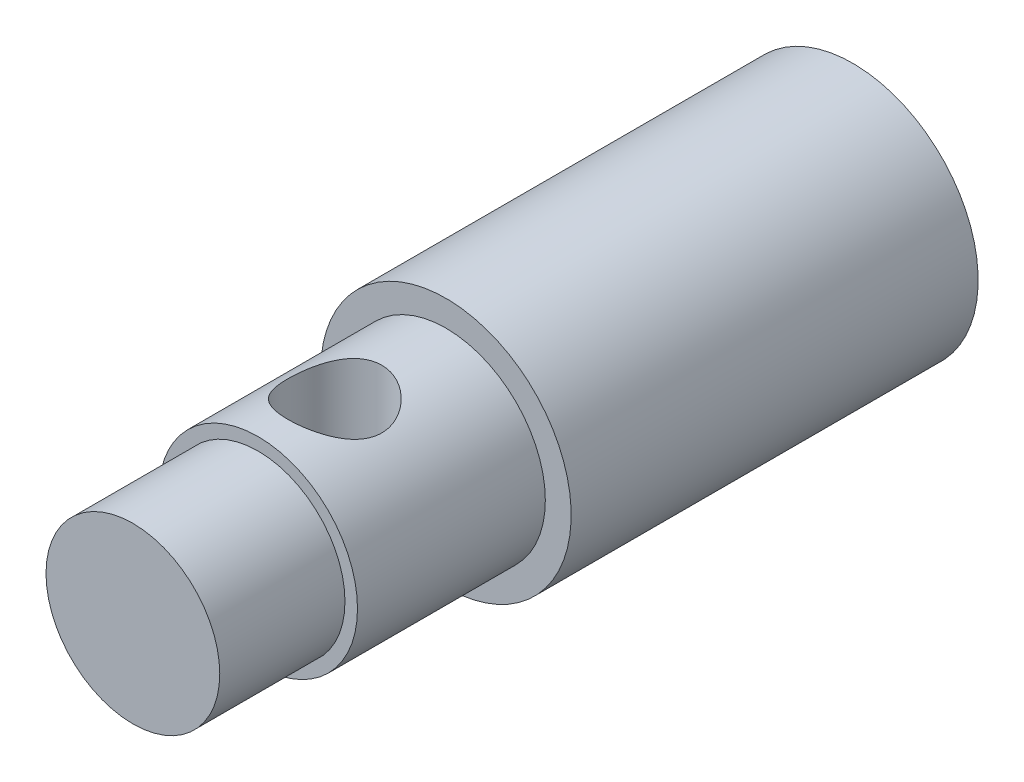
ISO-10303-21;
HEADER;
FILE_DESCRIPTION(('STEP AP214'),'2;1');
FILE_NAME('part.step','',(''),(''),'','','');
FILE_SCHEMA(('AUTOMOTIVE_DESIGN { 1 0 10303 214 1 1 1 1 }'));
ENDSEC;
DATA;
#1=APPLICATION_CONTEXT('core data for automotive mechanical design processes');
#2=APPLICATION_PROTOCOL_DEFINITION('international standard','automotive_design',2000,#1);
#3=PRODUCT_CONTEXT('',#1,'mechanical');
#4=PRODUCT('Part','Part','',(#3));
#5=PRODUCT_RELATED_PRODUCT_CATEGORY('part','',(#4));
#6=PRODUCT_DEFINITION_FORMATION('','',#4);
#7=PRODUCT_DEFINITION_CONTEXT('part definition',#1,'design');
#8=PRODUCT_DEFINITION('design','',#6,#7);
#9=PRODUCT_DEFINITION_SHAPE('','',#8);
#10=(LENGTH_UNIT() NAMED_UNIT(*) SI_UNIT(.MILLI.,.METRE.));
#11=(NAMED_UNIT(*) PLANE_ANGLE_UNIT() SI_UNIT($,.RADIAN.));
#12=(NAMED_UNIT(*) SI_UNIT($,.STERADIAN.) SOLID_ANGLE_UNIT());
#13=UNCERTAINTY_MEASURE_WITH_UNIT(LENGTH_MEASURE(1.E-05),#10,'distance_accuracy_value','');
#14=(GEOMETRIC_REPRESENTATION_CONTEXT(3) GLOBAL_UNCERTAINTY_ASSIGNED_CONTEXT((#13)) GLOBAL_UNIT_ASSIGNED_CONTEXT((#10,
#11,#12)) REPRESENTATION_CONTEXT('',''));
#15=CARTESIAN_POINT('',(0.,0.,0.));
#16=DIRECTION('',(0.,0.,1.));
#17=DIRECTION('',(1.,0.,0.));
#18=AXIS2_PLACEMENT_3D('',#15,#16,#17);
#19=CARTESIAN_POINT('',(0.,0.,13.));
#20=DIRECTION('',(0.,0.,-1.));
#21=DIRECTION('',(-1.,0.,0.));
#22=AXIS2_PLACEMENT_3D('',#19,#20,#21);
#23=CYLINDRICAL_SURFACE('',#22,4.);
#24=CARTESIAN_POINT('',(0.,0.,13.));
#25=DIRECTION('',(0.,0.,1.));
#26=DIRECTION('',(1.,0.,0.));
#27=AXIS2_PLACEMENT_3D('',#24,#25,#26);
#28=CIRCLE('',#27,4.);
#29=CARTESIAN_POINT('',(-4.,0.,13.));
#30=VERTEX_POINT('',#29);
#31=EDGE_CURVE('E60',#30,#30,#28,.T.);
#32=CARTESIAN_POINT('',(0.,0.,0.));
#33=DIRECTION('',(0.,0.,1.));
#34=DIRECTION('',(1.,0.,0.));
#35=AXIS2_PLACEMENT_3D('',#32,#33,#34);
#36=CIRCLE('',#35,4.);
#37=CARTESIAN_POINT('',(-4.,0.,0.));
#38=VERTEX_POINT('',#37);
#39=EDGE_CURVE('E68',#38,#38,#36,.T.);
#40=CARTESIAN_POINT('',(-4.,0.,13.));
#41=CARTESIAN_POINT('',(-4.,0.,12.8645833333333));
#42=CARTESIAN_POINT('',(-4.,0.,12.7291666666667));
#43=CARTESIAN_POINT('',(-4.,0.,12.4583333333333));
#44=CARTESIAN_POINT('',(-4.,0.,12.3229166666667));
#45=CARTESIAN_POINT('',(-4.,0.,12.0520833333333));
#46=CARTESIAN_POINT('',(-4.,0.,11.9166666666667));
#47=CARTESIAN_POINT('',(-4.,0.,11.6458333333333));
#48=CARTESIAN_POINT('',(-4.,0.,11.5104166666667));
#49=CARTESIAN_POINT('',(-4.,0.,11.2395833333333));
#50=CARTESIAN_POINT('',(-4.,0.,11.1041666666667));
#51=CARTESIAN_POINT('',(-4.,0.,10.8333333333333));
#52=CARTESIAN_POINT('',(-4.,0.,10.6979166666667));
#53=CARTESIAN_POINT('',(-4.,0.,10.4270833333333));
#54=CARTESIAN_POINT('',(-4.,0.,10.2916666666667));
#55=CARTESIAN_POINT('',(-4.,0.,10.0208333333333));
#56=CARTESIAN_POINT('',(-4.,0.,9.88541666666667));
#57=CARTESIAN_POINT('',(-4.,0.,9.61458333333333));
#58=CARTESIAN_POINT('',(-4.,0.,9.47916666666667));
#59=CARTESIAN_POINT('',(-4.,0.,9.20833333333333));
#60=CARTESIAN_POINT('',(-4.,0.,9.07291666666667));
#61=CARTESIAN_POINT('',(-4.,0.,8.80208333333333));
#62=CARTESIAN_POINT('',(-4.,0.,8.66666666666667));
#63=CARTESIAN_POINT('',(-4.,0.,8.39583333333333));
#64=CARTESIAN_POINT('',(-4.,0.,8.26041666666667));
#65=CARTESIAN_POINT('',(-4.,0.,7.98958333333333));
#66=CARTESIAN_POINT('',(-4.,0.,7.85416666666667));
#67=CARTESIAN_POINT('',(-4.,0.,7.58333333333333));
#68=CARTESIAN_POINT('',(-4.,0.,7.44791666666667));
#69=CARTESIAN_POINT('',(-4.,0.,7.17708333333333));
#70=CARTESIAN_POINT('',(-4.,0.,7.04166666666667));
#71=CARTESIAN_POINT('',(-4.,0.,6.77083333333333));
#72=CARTESIAN_POINT('',(-4.,0.,6.63541666666667));
#73=CARTESIAN_POINT('',(-4.,0.,6.36458333333333));
#74=CARTESIAN_POINT('',(-4.,0.,6.22916666666667));
#75=CARTESIAN_POINT('',(-4.,0.,5.95833333333333));
#76=CARTESIAN_POINT('',(-4.,0.,5.82291666666667));
#77=CARTESIAN_POINT('',(-4.,0.,5.55208333333333));
#78=CARTESIAN_POINT('',(-4.,0.,5.41666666666667));
#79=CARTESIAN_POINT('',(-4.,0.,5.14583333333333));
#80=CARTESIAN_POINT('',(-4.,0.,5.01041666666667));
#81=CARTESIAN_POINT('',(-4.,0.,4.73958333333333));
#82=CARTESIAN_POINT('',(-4.,0.,4.60416666666667));
#83=CARTESIAN_POINT('',(-4.,0.,4.33333333333333));
#84=CARTESIAN_POINT('',(-4.,0.,4.19791666666667));
#85=CARTESIAN_POINT('',(-4.,0.,3.92708333333333));
#86=CARTESIAN_POINT('',(-4.,0.,3.79166666666667));
#87=CARTESIAN_POINT('',(-4.,0.,3.52083333333333));
#88=CARTESIAN_POINT('',(-4.,0.,3.38541666666667));
#89=CARTESIAN_POINT('',(-4.,0.,3.11458333333333));
#90=CARTESIAN_POINT('',(-4.,0.,2.97916666666667));
#91=CARTESIAN_POINT('',(-4.,0.,2.70833333333333));
#92=CARTESIAN_POINT('',(-4.,0.,2.57291666666667));
#93=CARTESIAN_POINT('',(-4.,0.,2.30208333333333));
#94=CARTESIAN_POINT('',(-4.,0.,2.16666666666667));
#95=CARTESIAN_POINT('',(-4.,0.,1.89583333333333));
#96=CARTESIAN_POINT('',(-4.,0.,1.76041666666667));
#97=CARTESIAN_POINT('',(-4.,0.,1.48958333333333));
#98=CARTESIAN_POINT('',(-4.,0.,1.35416666666667));
#99=CARTESIAN_POINT('',(-4.,0.,1.08333333333333));
#100=CARTESIAN_POINT('',(-4.,0.,0.947916666666667));
#101=CARTESIAN_POINT('',(-4.,0.,0.677083333333334));
#102=CARTESIAN_POINT('',(-4.,0.,0.541666666666667));
#103=CARTESIAN_POINT('',(-4.,0.,0.270833333333334));
#104=CARTESIAN_POINT('',(-4.,0.,0.135416666666667));
#105=CARTESIAN_POINT('',(-4.,0.,0.));
#106=B_SPLINE_CURVE_WITH_KNOTS('',3,(#40,#41,#42,#43,#44,#45,#46,#47,#48,#49,#50,#51,#52,#53,
#54,#55,#56,#57,#58,#59,#60,#61,#62,#63,#64,#65,#66,#67,#68,#69,#70,#71,#72,#73,#74,#75,#76,#77,
#78,#79,#80,#81,#82,#83,#84,#85,#86,#87,#88,#89,#90,#91,#92,#93,#94,#95,#96,#97,#98,#99,#100,
#101,#102,#103,#104,#105),.UNSPECIFIED.,.F.,.F.,(4,2,2,2,2,2,2,2,2,2,2,2,2,2,2,2,2,2,2,2,2,2,2,
2,2,2,2,2,2,2,2,2,4),(0.,0.406249999999999,0.812499999999999,1.21875,1.625,2.03125,2.4375,
2.84375,3.25,3.65625,4.0625,4.46875,4.875,5.28125,5.6875,6.09375,6.5,6.90625,7.3125,7.71875,
8.125,8.53125,8.9375,9.34375,9.75,10.15625,10.5625,10.96875,11.375,11.78125,12.1875,12.59375,
13.),.UNSPECIFIED.);
#107=EDGE_CURVE('BSEAM41',#30,#38,#106,.T.);
#108=ORIENTED_EDGE('',*,*,#31,.F.);
#109=ORIENTED_EDGE('',*,*,#39,.T.);
#110=ORIENTED_EDGE('',*,*,#107,.T.);
#111=ORIENTED_EDGE('',*,*,#107,.F.);
#112=EDGE_LOOP('',(#108,#110,#109,#111));
#113=FACE_BOUND('',#112,.T.);
#114=ADVANCED_FACE('F41',(#113),#23,.T.);
#115=CARTESIAN_POINT('',(0.,0.,13.));
#116=DIRECTION('',(0.,0.,1.));
#117=DIRECTION('',(1.,0.,0.));
#118=AXIS2_PLACEMENT_3D('',#115,#116,#117);
#119=PLANE('',#118);
#120=CARTESIAN_POINT('',(0.,0.,13.));
#121=DIRECTION('',(0.,0.,1.));
#122=DIRECTION('',(1.,0.,0.));
#123=AXIS2_PLACEMENT_3D('',#120,#121,#122);
#124=CIRCLE('',#123,3.175);
#125=CARTESIAN_POINT('',(3.175,0.,13.));
#126=VERTEX_POINT('',#125);
#127=EDGE_CURVE('E54',#126,#126,#124,.T.);
#128=ORIENTED_EDGE('',*,*,#127,.F.);
#129=EDGE_LOOP('',(#128));
#130=FACE_BOUND('',#129,.T.);
#131=ORIENTED_EDGE('',*,*,#31,.T.);
#132=EDGE_LOOP('',(#131));
#133=FACE_BOUND('',#132,.T.);
#134=ADVANCED_FACE('F108',(#130,#133),#119,.T.);
#135=CARTESIAN_POINT('',(0.,0.,0.));
#136=DIRECTION('',(0.,0.,1.));
#137=DIRECTION('',(1.,0.,0.));
#138=AXIS2_PLACEMENT_3D('',#135,#136,#137);
#139=PLANE('',#138);
#140=ORIENTED_EDGE('',*,*,#39,.F.);
#141=EDGE_LOOP('',(#140));
#142=FACE_BOUND('',#141,.T.);
#143=ADVANCED_FACE('F104',(#142),#139,.F.);
#144=CARTESIAN_POINT('',(0.,0.,19.));
#145=DIRECTION('',(0.,0.,-1.));
#146=DIRECTION('',(-1.,0.,0.));
#147=AXIS2_PLACEMENT_3D('',#144,#145,#146);
#148=CYLINDRICAL_SURFACE('',#147,3.175);
#149=CARTESIAN_POINT('',(0.,-3.175,18.05));
#150=CARTESIAN_POINT('',(0.0793696056331877,-3.17499621985294,18.0499955261035));
#151=CARTESIAN_POINT('',(0.158848966213319,-3.17199120370814,18.0436633534842));
#152=CARTESIAN_POINT('',(0.3154907966577,-3.16026762742416,18.0185996128575));
#153=CARTESIAN_POINT('',(0.392647876041672,-3.15153670753249,17.9998412211258));
#154=CARTESIAN_POINT('',(0.54213461401645,-3.1292818514019,17.9508046338603));
#155=CARTESIAN_POINT('',(0.614481134826975,-3.11577583396693,17.920569474688));
#156=CARTESIAN_POINT('',(0.752982757479881,-3.08523557557938,17.8496444683175));
#157=CARTESIAN_POINT('',(0.819138798737006,-3.06820187122341,17.8089562109142));
#158=CARTESIAN_POINT('',(0.947531977551393,-3.03109215002452,17.7156866275469));
#159=CARTESIAN_POINT('',(1.00934531536298,-3.01089949607389,17.6625689176526));
#160=CARTESIAN_POINT('',(1.12356872804672,-2.97016877751052,17.5470940154181));
#161=CARTESIAN_POINT('',(1.17597245123061,-2.94963048974006,17.4847306335115));
#162=CARTESIAN_POINT('',(1.27340721108708,-2.90895734211161,17.3474843645497));
#163=CARTESIAN_POINT('',(1.31770529611402,-2.88894252906622,17.2720415431448));
#164=CARTESIAN_POINT('',(1.39279860497067,-2.85350194913633,17.1137145060508));
#165=CARTESIAN_POINT('',(1.4236026358555,-2.83807319122874,17.0308351865709));
#166=CARTESIAN_POINT('',(1.46896762087975,-2.81484981523147,16.8648173299765));
#167=CARTESIAN_POINT('',(1.48434942407678,-2.80667245171199,16.7819591045865));
#168=CARTESIAN_POINT('',(1.50096994970779,-2.79782290647243,16.6144666996695));
#169=CARTESIAN_POINT('',(1.5022201551264,-2.79714463118969,16.5298340180599));
#170=CARTESIAN_POINT('',(1.49114871052963,-2.80305593263808,16.3706246914023));
#171=CARTESIAN_POINT('',(1.48022366031689,-2.80889771224103,16.2959168405557));
#172=CARTESIAN_POINT('',(1.44750469243097,-2.82589657910714,16.1495553191353));
#173=CARTESIAN_POINT('',(1.42570787921159,-2.83705508237193,16.0779024677406));
#174=CARTESIAN_POINT('',(1.37144042107045,-2.86368711079333,15.9376785427478));
#175=CARTESIAN_POINT('',(1.33873421633754,-2.87925460442575,15.8692173067294));
#176=CARTESIAN_POINT('',(1.26375034917989,-2.91294481240157,15.7384442293082));
#177=CARTESIAN_POINT('',(1.22146847336964,-2.93106865023239,15.6761351122786));
#178=CARTESIAN_POINT('',(1.12301829304094,-2.97027967308475,15.5521139821014));
#179=CARTESIAN_POINT('',(1.06582685913966,-2.99147184174414,15.4912446582645));
#180=CARTESIAN_POINT('',(0.941911654521739,-3.03276969244737,15.3796330789879));
#181=CARTESIAN_POINT('',(0.875184240523148,-3.05287495516681,15.3288947119873));
#182=CARTESIAN_POINT('',(0.730900451942526,-3.09065813188422,15.2372344695054));
#183=CARTESIAN_POINT('',(0.65303276474939,-3.10821737934191,15.1967498749094));
#184=CARTESIAN_POINT('',(0.490549806409964,-3.13795896561378,15.1297651472587));
#185=CARTESIAN_POINT('',(0.405939389394616,-3.15014513198241,15.1032550567205));
#186=CARTESIAN_POINT('',(0.239325331183663,-3.16698849385516,15.0669532783005));
#187=CARTESIAN_POINT('',(0.157618085372369,-3.17215069636453,15.0560369777487));
#188=CARTESIAN_POINT('',(-0.00662006237334126,-3.17605374308904,15.0477654982747));
#189=CARTESIAN_POINT('',(-0.0891506200914323,-3.17479716715133,15.050404871034));
#190=CARTESIAN_POINT('',(-0.246790904756254,-3.16631250425399,15.0684589502259));
#191=CARTESIAN_POINT('',(-0.322025617263288,-3.15949303898597,15.0829996821211));
#192=CARTESIAN_POINT('',(-0.468859911387633,-3.14106249856194,15.1231274662938));
#193=CARTESIAN_POINT('',(-0.540459070755478,-3.12945086824544,15.1487157984244));
#194=CARTESIAN_POINT('',(-0.680482664613306,-3.10206629000487,15.2109727759805));
#195=CARTESIAN_POINT('',(-0.748744433690326,-3.0861775760538,15.2479545958558));
#196=CARTESIAN_POINT('',(-0.878333413113474,-3.05182842645659,15.3316054255488));
#197=CARTESIAN_POINT('',(-0.939657562453442,-3.0333668635778,15.3782786858565));
#198=CARTESIAN_POINT('',(-1.05944471500475,-2.99374847615918,15.4848401643062));
#199=CARTESIAN_POINT('',(-1.11715821701519,-2.97249840501299,15.5455380300826));
#200=CARTESIAN_POINT('',(-1.22187582163969,-2.9310107026401,15.6759200433733));
#201=CARTESIAN_POINT('',(-1.26887443843489,-2.91077359415055,15.7456087655742));
#202=CARTESIAN_POINT('',(-1.3523177360002,-2.87298422238289,15.8951586056998));
#203=CARTESIAN_POINT('',(-1.3883357483136,-2.85555063245793,15.9752902768506));
#204=CARTESIAN_POINT('',(-1.44599796651068,-2.82679504093384,16.1415757360809));
#205=CARTESIAN_POINT('',(-1.46765854978947,-2.81546607860886,16.2277225382813));
#206=CARTESIAN_POINT('',(-1.49416555358527,-2.80148148307169,16.395136597093));
#207=CARTESIAN_POINT('',(-1.50036748851185,-2.79812792823292,16.4761304717313));
#208=CARTESIAN_POINT('',(-1.4995991124721,-2.79854075870541,16.6380256718279));
#209=CARTESIAN_POINT('',(-1.4926327833113,-2.80230499174775,16.7189270178634));
#210=CARTESIAN_POINT('',(-1.46695547456854,-2.81582109373829,16.8718618581667));
#211=CARTESIAN_POINT('',(-1.44918362899975,-2.82509293077013,16.944100315709));
#212=CARTESIAN_POINT('',(-1.40347262111118,-2.84807658169596,17.0845289541074));
#213=CARTESIAN_POINT('',(-1.37553039996268,-2.86178973121637,17.1527179098565));
#214=CARTESIAN_POINT('',(-1.30816165903836,-2.89323433363553,17.2881105518292));
#215=CARTESIAN_POINT('',(-1.26809407534009,-2.9111726221189,17.3549459695603));
#216=CARTESIAN_POINT('',(-1.17838069734069,-2.94862781691945,17.4813607981843));
#217=CARTESIAN_POINT('',(-1.12873032344155,-2.96814547541437,17.5409367174796));
#218=CARTESIAN_POINT('',(-1.01518945377103,-3.00898948839188,17.6575560784686));
#219=CARTESIAN_POINT('',(-0.950355540908532,-3.03029315236505,17.7136938134171));
#220=CARTESIAN_POINT('',(-0.811506446201231,-3.07039060771353,17.8144417542749));
#221=CARTESIAN_POINT('',(-0.737486850130155,-3.08918318329392,17.8590463858981));
#222=CARTESIAN_POINT('',(-0.582310323359667,-3.12214803509559,17.9350463197749));
#223=CARTESIAN_POINT('',(-0.501179295246573,-3.13633626105316,17.9664873338392));
#224=CARTESIAN_POINT('',(-0.334041202489531,-3.15849550789229,18.0149024240255));
#225=CARTESIAN_POINT('',(-0.248049357078898,-3.16648489362115,18.0319192475962));
#226=CARTESIAN_POINT('',(-0.134449327489635,-3.17226666174443,18.0442064333984));
#227=CARTESIAN_POINT('',(-0.10761975081623,-3.17328951708221,18.0463765519968));
#228=CARTESIAN_POINT('',(-0.0538643319459685,-3.17465683516496,18.0492741103809));
#229=CARTESIAN_POINT('',(-0.0269384876468131,-3.17500128300303,18.0500015184655));
#230=CARTESIAN_POINT('',(0.,-3.175,18.05));
#231=B_SPLINE_CURVE_WITH_KNOTS('',3,(#149,#150,#151,#152,#153,#154,#155,#156,#157,#158,#159,
#160,#161,#162,#163,#164,#165,#166,#167,#168,#169,#170,#171,#172,#173,#174,#175,#176,#177,#178,
#179,#180,#181,#182,#183,#184,#185,#186,#187,#188,#189,#190,#191,#192,#193,#194,#195,#196,#197,
#198,#199,#200,#201,#202,#203,#204,#205,#206,#207,#208,#209,#210,#211,#212,#213,#214,#215,#216,
#217,#218,#219,#220,#221,#222,#223,#224,#225,#226,#227,#228,#229,#230),.UNSPECIFIED.,.T.,.F.,(4,
2,2,2,2,2,2,2,2,2,2,2,2,2,2,2,2,2,2,2,2,2,2,2,2,2,2,2,2,2,2,2,2,2,2,2,2,2,2,2,4),(0.,
0.237998863435127,0.476513162034361,0.714141760487187,0.951734239756925,1.202566267352,
1.4535669805023,1.72144991719773,1.98915775546694,2.24170968929962,2.4940563909499,
2.72018464462581,2.94637315667183,3.17780125644152,3.40933138528568,3.66670059385932,
3.92416839616744,4.19124985366182,4.45814074508092,4.70459764976704,4.9509555058397,
5.18069145066332,5.41045401730286,5.6472008989094,5.88405183355053,6.14213867221335,
6.40035735120202,6.66760822573518,6.93455372246492,7.17710763594645,7.41958821796887,
7.64352093670395,7.86752106087491,8.10644389425159,8.34548119240929,8.60934561245708,
8.87333732850241,9.13640455025375,9.39868939422998,9.47946576344206,9.56024390756228),.UNSPECIFIED.);
#232=CARTESIAN_POINT('',(0.,-3.175,18.05));
#233=VERTEX_POINT('',#232);
#234=EDGE_CURVE('E44',#233,#233,#231,.T.);
#235=ORIENTED_EDGE('',*,*,#234,.T.);
#236=EDGE_LOOP('',(#235));
#237=FACE_BOUND('',#236,.T.);
#238=CARTESIAN_POINT('',(0.,3.175,18.05));
#239=CARTESIAN_POINT('',(-0.0793696056331877,3.17499621985294,18.0499955261035));
#240=CARTESIAN_POINT('',(-0.158848966213319,3.17199120370814,18.0436633534842));
#241=CARTESIAN_POINT('',(-0.3154907966577,3.16026762742416,18.0185996128575));
#242=CARTESIAN_POINT('',(-0.392647876041672,3.15153670753249,17.9998412211258));
#243=CARTESIAN_POINT('',(-0.54213461401645,3.1292818514019,17.9508046338603));
#244=CARTESIAN_POINT('',(-0.614481134826975,3.11577583396693,17.920569474688));
#245=CARTESIAN_POINT('',(-0.752982757479881,3.08523557557938,17.8496444683175));
#246=CARTESIAN_POINT('',(-0.819138798737006,3.06820187122341,17.8089562109142));
#247=CARTESIAN_POINT('',(-0.947531977551393,3.03109215002452,17.7156866275469));
#248=CARTESIAN_POINT('',(-1.00934531536298,3.01089949607389,17.6625689176526));
#249=CARTESIAN_POINT('',(-1.12356872804672,2.97016877751052,17.5470940154181));
#250=CARTESIAN_POINT('',(-1.17597245123061,2.94963048974006,17.4847306335115));
#251=CARTESIAN_POINT('',(-1.27340721108708,2.90895734211161,17.3474843645497));
#252=CARTESIAN_POINT('',(-1.31770529611402,2.88894252906622,17.2720415431448));
#253=CARTESIAN_POINT('',(-1.39279860497067,2.85350194913633,17.1137145060508));
#254=CARTESIAN_POINT('',(-1.4236026358555,2.83807319122874,17.0308351865709));
#255=CARTESIAN_POINT('',(-1.46896762087975,2.81484981523147,16.8648173299765));
#256=CARTESIAN_POINT('',(-1.48434942407678,2.80667245171199,16.7819591045865));
#257=CARTESIAN_POINT('',(-1.50096994970779,2.79782290647243,16.6144666996695));
#258=CARTESIAN_POINT('',(-1.5022201551264,2.79714463118969,16.5298340180599));
#259=CARTESIAN_POINT('',(-1.49114871052963,2.80305593263808,16.3706246914023));
#260=CARTESIAN_POINT('',(-1.48022366031689,2.80889771224103,16.2959168405557));
#261=CARTESIAN_POINT('',(-1.44750469243097,2.82589657910714,16.1495553191353));
#262=CARTESIAN_POINT('',(-1.42570787921159,2.83705508237193,16.0779024677406));
#263=CARTESIAN_POINT('',(-1.37144042107045,2.86368711079333,15.9376785427478));
#264=CARTESIAN_POINT('',(-1.33873421633754,2.87925460442575,15.8692173067294));
#265=CARTESIAN_POINT('',(-1.26375034917989,2.91294481240157,15.7384442293082));
#266=CARTESIAN_POINT('',(-1.22146847336964,2.93106865023239,15.6761351122786));
#267=CARTESIAN_POINT('',(-1.12301829304094,2.97027967308475,15.5521139821014));
#268=CARTESIAN_POINT('',(-1.06582685913966,2.99147184174414,15.4912446582645));
#269=CARTESIAN_POINT('',(-0.941911654521739,3.03276969244737,15.3796330789879));
#270=CARTESIAN_POINT('',(-0.875184240523148,3.05287495516681,15.3288947119873));
#271=CARTESIAN_POINT('',(-0.730900451942526,3.09065813188422,15.2372344695054));
#272=CARTESIAN_POINT('',(-0.65303276474939,3.10821737934191,15.1967498749094));
#273=CARTESIAN_POINT('',(-0.490549806409964,3.13795896561378,15.1297651472587));
#274=CARTESIAN_POINT('',(-0.405939389394616,3.15014513198241,15.1032550567205));
#275=CARTESIAN_POINT('',(-0.239325331183663,3.16698849385516,15.0669532783005));
#276=CARTESIAN_POINT('',(-0.157618085372369,3.17215069636453,15.0560369777487));
#277=CARTESIAN_POINT('',(0.00662006237334126,3.17605374308904,15.0477654982747));
#278=CARTESIAN_POINT('',(0.0891506200914323,3.17479716715133,15.050404871034));
#279=CARTESIAN_POINT('',(0.246790904756254,3.16631250425399,15.0684589502259));
#280=CARTESIAN_POINT('',(0.322025617263288,3.15949303898597,15.0829996821211));
#281=CARTESIAN_POINT('',(0.468859911387633,3.14106249856194,15.1231274662938));
#282=CARTESIAN_POINT('',(0.540459070755478,3.12945086824544,15.1487157984244));
#283=CARTESIAN_POINT('',(0.680482664613306,3.10206629000487,15.2109727759805));
#284=CARTESIAN_POINT('',(0.748744433690326,3.0861775760538,15.2479545958558));
#285=CARTESIAN_POINT('',(0.878333413113474,3.05182842645659,15.3316054255488));
#286=CARTESIAN_POINT('',(0.939657562453442,3.0333668635778,15.3782786858565));
#287=CARTESIAN_POINT('',(1.05944471500475,2.99374847615918,15.4848401643062));
#288=CARTESIAN_POINT('',(1.11715821701519,2.97249840501299,15.5455380300826));
#289=CARTESIAN_POINT('',(1.22187582163969,2.9310107026401,15.6759200433733));
#290=CARTESIAN_POINT('',(1.26887443843489,2.91077359415055,15.7456087655742));
#291=CARTESIAN_POINT('',(1.3523177360002,2.87298422238289,15.8951586056998));
#292=CARTESIAN_POINT('',(1.3883357483136,2.85555063245793,15.9752902768506));
#293=CARTESIAN_POINT('',(1.44599796651068,2.82679504093384,16.1415757360809));
#294=CARTESIAN_POINT('',(1.46765854978947,2.81546607860886,16.2277225382813));
#295=CARTESIAN_POINT('',(1.49416555358527,2.80148148307169,16.395136597093));
#296=CARTESIAN_POINT('',(1.50036748851185,2.79812792823292,16.4761304717313));
#297=CARTESIAN_POINT('',(1.4995991124721,2.79854075870541,16.6380256718279));
#298=CARTESIAN_POINT('',(1.4926327833113,2.80230499174775,16.7189270178634));
#299=CARTESIAN_POINT('',(1.46695547456854,2.81582109373829,16.8718618581667));
#300=CARTESIAN_POINT('',(1.44918362899975,2.82509293077013,16.944100315709));
#301=CARTESIAN_POINT('',(1.40347262111118,2.84807658169596,17.0845289541074));
#302=CARTESIAN_POINT('',(1.37553039996268,2.86178973121637,17.1527179098565));
#303=CARTESIAN_POINT('',(1.30816165903836,2.89323433363553,17.2881105518292));
#304=CARTESIAN_POINT('',(1.26809407534009,2.9111726221189,17.3549459695603));
#305=CARTESIAN_POINT('',(1.17838069734069,2.94862781691945,17.4813607981843));
#306=CARTESIAN_POINT('',(1.12873032344155,2.96814547541437,17.5409367174796));
#307=CARTESIAN_POINT('',(1.01518945377103,3.00898948839188,17.6575560784686));
#308=CARTESIAN_POINT('',(0.950355540908532,3.03029315236505,17.7136938134171));
#309=CARTESIAN_POINT('',(0.811506446201231,3.07039060771353,17.8144417542749));
#310=CARTESIAN_POINT('',(0.737486850130155,3.08918318329392,17.8590463858981));
#311=CARTESIAN_POINT('',(0.582310323359667,3.12214803509559,17.9350463197749));
#312=CARTESIAN_POINT('',(0.501179295246573,3.13633626105316,17.9664873338392));
#313=CARTESIAN_POINT('',(0.334041202489531,3.15849550789229,18.0149024240255));
#314=CARTESIAN_POINT('',(0.248049357078898,3.16648489362115,18.0319192475962));
#315=CARTESIAN_POINT('',(0.134449327489635,3.17226666174443,18.0442064333984));
#316=CARTESIAN_POINT('',(0.10761975081623,3.17328951708221,18.0463765519968));
#317=CARTESIAN_POINT('',(0.0538643319459685,3.17465683516496,18.0492741103809));
#318=CARTESIAN_POINT('',(0.0269384876468131,3.17500128300303,18.0500015184655));
#319=CARTESIAN_POINT('',(0.,3.175,18.05));
#320=B_SPLINE_CURVE_WITH_KNOTS('',3,(#238,#239,#240,#241,#242,#243,#244,#245,#246,#247,#248,
#249,#250,#251,#252,#253,#254,#255,#256,#257,#258,#259,#260,#261,#262,#263,#264,#265,#266,#267,
#268,#269,#270,#271,#272,#273,#274,#275,#276,#277,#278,#279,#280,#281,#282,#283,#284,#285,#286,
#287,#288,#289,#290,#291,#292,#293,#294,#295,#296,#297,#298,#299,#300,#301,#302,#303,#304,#305,
#306,#307,#308,#309,#310,#311,#312,#313,#314,#315,#316,#317,#318,#319),.UNSPECIFIED.,.T.,.F.,(4,
2,2,2,2,2,2,2,2,2,2,2,2,2,2,2,2,2,2,2,2,2,2,2,2,2,2,2,2,2,2,2,2,2,2,2,2,2,2,2,4),(0.,
0.237998863435127,0.476513162034361,0.714141760487187,0.951734239756925,1.202566267352,
1.4535669805023,1.72144991719773,1.98915775546694,2.24170968929962,2.4940563909499,
2.72018464462581,2.94637315667183,3.17780125644152,3.40933138528568,3.66670059385932,
3.92416839616744,4.19124985366182,4.45814074508092,4.70459764976704,4.9509555058397,
5.18069145066332,5.41045401730286,5.6472008989094,5.88405183355053,6.14213867221335,
6.40035735120202,6.66760822573518,6.93455372246492,7.17710763594645,7.41958821796887,
7.64352093670395,7.86752106087491,8.10644389425159,8.34548119240929,8.60934561245708,
8.87333732850241,9.13640455025375,9.39868939422998,9.47946576344206,9.56024390756228),.UNSPECIFIED.);
#321=CARTESIAN_POINT('',(0.,3.175,18.05));
#322=VERTEX_POINT('',#321);
#323=EDGE_CURVE('E75',#322,#322,#320,.T.);
#324=ORIENTED_EDGE('',*,*,#323,.T.);
#325=EDGE_LOOP('',(#324));
#326=FACE_BOUND('',#325,.T.);
#327=CARTESIAN_POINT('',(0.,0.,19.));
#328=DIRECTION('',(0.,0.,1.));
#329=DIRECTION('',(1.,0.,0.));
#330=AXIS2_PLACEMENT_3D('',#327,#328,#329);
#331=CIRCLE('',#330,3.175);
#332=CARTESIAN_POINT('',(3.175,0.,19.));
#333=VERTEX_POINT('',#332);
#334=EDGE_CURVE('E65',#333,#333,#331,.T.);
#335=ORIENTED_EDGE('',*,*,#334,.F.);
#336=EDGE_LOOP('',(#335));
#337=FACE_BOUND('',#336,.T.);
#338=ORIENTED_EDGE('',*,*,#127,.T.);
#339=EDGE_LOOP('',(#338));
#340=FACE_BOUND('',#339,.T.);
#341=ADVANCED_FACE('F81',(#237,#326,#337,#340),#148,.T.);
#342=CARTESIAN_POINT('',(0.,0.,19.));
#343=DIRECTION('',(0.,0.,1.));
#344=DIRECTION('',(1.,0.,0.));
#345=AXIS2_PLACEMENT_3D('',#342,#343,#344);
#346=PLANE('',#345);
#347=CARTESIAN_POINT('',(0.,0.,19.));
#348=DIRECTION('',(0.,0.,1.));
#349=DIRECTION('',(1.,0.,0.));
#350=AXIS2_PLACEMENT_3D('',#347,#348,#349);
#351=CIRCLE('',#350,2.775);
#352=CARTESIAN_POINT('',(2.775,0.,19.));
#353=VERTEX_POINT('',#352);
#354=EDGE_CURVE('E10',#353,#353,#351,.T.);
#355=ORIENTED_EDGE('',*,*,#354,.F.);
#356=EDGE_LOOP('',(#355));
#357=FACE_BOUND('',#356,.T.);
#358=ORIENTED_EDGE('',*,*,#334,.T.);
#359=EDGE_LOOP('',(#358));
#360=FACE_BOUND('',#359,.T.);
#361=ADVANCED_FACE('F97',(#357,#360),#346,.T.);
#362=CARTESIAN_POINT('',(0.,0.,23.));
#363=DIRECTION('',(0.,0.,-1.));
#364=DIRECTION('',(-1.,0.,0.));
#365=AXIS2_PLACEMENT_3D('',#362,#363,#364);
#366=CYLINDRICAL_SURFACE('',#365,2.775);
#367=CARTESIAN_POINT('',(0.,0.,23.));
#368=DIRECTION('',(0.,0.,1.));
#369=DIRECTION('',(1.,0.,0.));
#370=AXIS2_PLACEMENT_3D('',#367,#368,#369);
#371=CIRCLE('',#370,2.775);
#372=CARTESIAN_POINT('',(2.775,0.,23.));
#373=VERTEX_POINT('',#372);
#374=EDGE_CURVE('E64',#373,#373,#371,.T.);
#375=ORIENTED_EDGE('',*,*,#374,.F.);
#376=EDGE_LOOP('',(#375));
#377=FACE_BOUND('',#376,.T.);
#378=ORIENTED_EDGE('',*,*,#354,.T.);
#379=EDGE_LOOP('',(#378));
#380=FACE_BOUND('',#379,.T.);
#381=ADVANCED_FACE('F94',(#377,#380),#366,.T.);
#382=CARTESIAN_POINT('',(0.,0.,23.));
#383=DIRECTION('',(0.,0.,1.));
#384=DIRECTION('',(1.,0.,0.));
#385=AXIS2_PLACEMENT_3D('',#382,#383,#384);
#386=PLANE('',#385);
#387=ORIENTED_EDGE('',*,*,#374,.T.);
#388=EDGE_LOOP('',(#387));
#389=FACE_BOUND('',#388,.T.);
#390=ADVANCED_FACE('F89',(#389),#386,.T.);
#391=CARTESIAN_POINT('',(0.,-4.,16.55));
#392=DIRECTION('',(0.,1.,0.));
#393=DIRECTION('',(0.,0.,1.));
#394=AXIS2_PLACEMENT_3D('',#391,#392,#393);
#395=CYLINDRICAL_SURFACE('',#394,1.5);
#396=ORIENTED_EDGE('',*,*,#323,.F.);
#397=EDGE_LOOP('',(#396));
#398=FACE_BOUND('',#397,.T.);
#399=ORIENTED_EDGE('',*,*,#234,.F.);
#400=EDGE_LOOP('',(#399));
#401=FACE_BOUND('',#400,.T.);
#402=ADVANCED_FACE('F85',(#398,#401),#395,.F.);
#403=CLOSED_SHELL('',(#114,#134,#143,#341,#361,#381,#390,#402));
#404=MANIFOLD_SOLID_BREP('B2',#403);
#405=ADVANCED_BREP_SHAPE_REPRESENTATION('',(#18,#404),#14);
#406=SHAPE_DEFINITION_REPRESENTATION(#9,#405);
ENDSEC;
END-ISO-10303-21;
